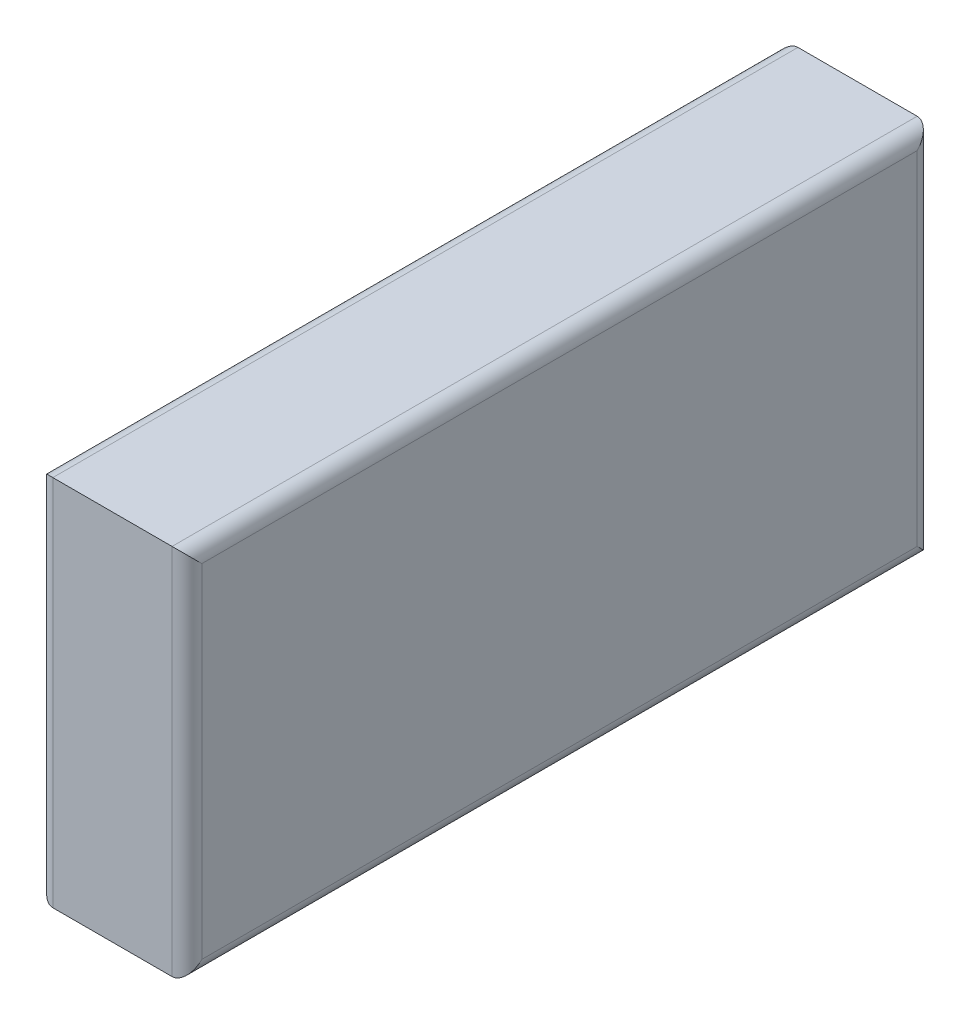
ISO-10303-21;
HEADER;
FILE_DESCRIPTION(('STEP AP214'),'2;1');
FILE_NAME('part.step','',(''),(''),'','','');
FILE_SCHEMA(('AUTOMOTIVE_DESIGN { 1 0 10303 214 1 1 1 1 }'));
ENDSEC;
DATA;
#1=APPLICATION_CONTEXT('core data for automotive mechanical design processes');
#2=APPLICATION_PROTOCOL_DEFINITION('international standard','automotive_design',2000,#1);
#3=PRODUCT_CONTEXT('',#1,'mechanical');
#4=PRODUCT('Part','Part','',(#3));
#5=PRODUCT_RELATED_PRODUCT_CATEGORY('part','',(#4));
#6=PRODUCT_DEFINITION_FORMATION('','',#4);
#7=PRODUCT_DEFINITION_CONTEXT('part definition',#1,'design');
#8=PRODUCT_DEFINITION('design','',#6,#7);
#9=PRODUCT_DEFINITION_SHAPE('','',#8);
#10=(LENGTH_UNIT() NAMED_UNIT(*) SI_UNIT(.MILLI.,.METRE.));
#11=(NAMED_UNIT(*) PLANE_ANGLE_UNIT() SI_UNIT($,.RADIAN.));
#12=(NAMED_UNIT(*) SI_UNIT($,.STERADIAN.) SOLID_ANGLE_UNIT());
#13=UNCERTAINTY_MEASURE_WITH_UNIT(LENGTH_MEASURE(1.E-05),#10,'distance_accuracy_value','');
#14=(GEOMETRIC_REPRESENTATION_CONTEXT(3) GLOBAL_UNCERTAINTY_ASSIGNED_CONTEXT((#13)) GLOBAL_UNIT_ASSIGNED_CONTEXT((#10,
#11,#12)) REPRESENTATION_CONTEXT('',''));
#15=CARTESIAN_POINT('',(0.,0.,0.));
#16=DIRECTION('',(0.,0.,1.));
#17=DIRECTION('',(1.,0.,0.));
#18=AXIS2_PLACEMENT_3D('',#15,#16,#17);
#19=CARTESIAN_POINT('',(-30.111803819155,8.0928080606027,100.));
#20=DIRECTION('',(1.,0.,0.));
#21=DIRECTION('',(0.,1.,0.));
#22=AXIS2_PLACEMENT_3D('',#19,#20,#21);
#23=PLANE('',#22);
#24=DIRECTION('',(0.,-1.,0.));
#25=VECTOR('',#24,1.);
#26=CARTESIAN_POINT('',(-30.111803819155,8.0928080606027,2.));
#27=LINE('',#26,#25);
#28=CARTESIAN_POINT('',(-30.111803819155,6.0928080606027,2.));
#29=VERTEX_POINT('',#28);
#30=CARTESIAN_POINT('',(-30.111803819155,-39.9071919393973,2.));
#31=VERTEX_POINT('',#30);
#32=EDGE_CURVE('E122',#29,#31,#27,.T.);
#33=ORIENTED_EDGE('',*,*,#32,.T.);
#34=DIRECTION('',(0.,0.,-1.));
#35=VECTOR('',#34,1.);
#36=CARTESIAN_POINT('',(-30.111803819155,-39.9071919393973,100.));
#37=LINE('',#36,#35);
#38=CARTESIAN_POINT('',(-30.111803819155,-39.9071919393973,98.));
#39=VERTEX_POINT('',#38);
#40=EDGE_CURVE('E117',#31,#39,#37,.F.);
#41=ORIENTED_EDGE('',*,*,#40,.T.);
#42=DIRECTION('',(0.,-1.,0.));
#43=VECTOR('',#42,1.);
#44=CARTESIAN_POINT('',(-30.111803819155,8.0928080606027,98.));
#45=LINE('',#44,#43);
#46=CARTESIAN_POINT('',(-30.111803819155,6.0928080606027,98.));
#47=VERTEX_POINT('',#46);
#48=EDGE_CURVE('E110',#39,#47,#45,.F.);
#49=ORIENTED_EDGE('',*,*,#48,.T.);
#50=DIRECTION('',(0.,0.,-1.));
#51=VECTOR('',#50,1.);
#52=CARTESIAN_POINT('',(-30.111803819155,6.0928080606027,100.));
#53=LINE('',#52,#51);
#54=EDGE_CURVE('E114',#47,#29,#53,.T.);
#55=ORIENTED_EDGE('',*,*,#54,.T.);
#56=EDGE_LOOP('',(#33,#41,#49,#55));
#57=FACE_BOUND('',#56,.T.);
#58=ADVANCED_FACE('F43',(#57),#23,.F.);
#59=CARTESIAN_POINT('',(-30.111803819155,-41.9071919393973,100.));
#60=DIRECTION('',(0.,1.,0.));
#61=DIRECTION('',(0.,0.,1.));
#62=AXIS2_PLACEMENT_3D('',#59,#60,#61);
#63=PLANE('',#62);
#64=DIRECTION('',(1.,0.,0.));
#65=VECTOR('',#64,1.);
#66=CARTESIAN_POINT('',(-30.111803819155,-41.9071919393973,100.));
#67=LINE('',#66,#65);
#68=CARTESIAN_POINT('',(-28.111803819155,-41.9071919393973,100.));
#69=VERTEX_POINT('',#68);
#70=CARTESIAN_POINT('',(-12.111803819155,-41.9071919393973,100.));
#71=VERTEX_POINT('',#70);
#72=EDGE_CURVE('E141',#69,#71,#67,.T.);
#73=ORIENTED_EDGE('',*,*,#72,.F.);
#74=DIRECTION('',(0.,0.,-1.));
#75=VECTOR('',#74,1.);
#76=CARTESIAN_POINT('',(-28.111803819155,-41.9071919393973,100.));
#77=LINE('',#76,#75);
#78=CARTESIAN_POINT('',(-28.111803819155,-41.9071919393973,0.));
#79=VERTEX_POINT('',#78);
#80=EDGE_CURVE('E179',#69,#79,#77,.T.);
#81=ORIENTED_EDGE('',*,*,#80,.T.);
#82=DIRECTION('',(1.,0.,0.));
#83=VECTOR('',#82,1.);
#84=CARTESIAN_POINT('',(-30.111803819155,-41.9071919393973,0.));
#85=LINE('',#84,#83);
#86=CARTESIAN_POINT('',(-12.111803819155,-41.9071919393973,0.));
#87=VERTEX_POINT('',#86);
#88=EDGE_CURVE('E131',#79,#87,#85,.T.);
#89=ORIENTED_EDGE('',*,*,#88,.T.);
#90=DIRECTION('',(0.,0.,-1.));
#91=VECTOR('',#90,1.);
#92=CARTESIAN_POINT('',(-12.111803819155,-41.9071919393973,100.));
#93=LINE('',#92,#91);
#94=EDGE_CURVE('E176',#87,#71,#93,.F.);
#95=ORIENTED_EDGE('',*,*,#94,.T.);
#96=EDGE_LOOP('',(#73,#81,#89,#95));
#97=FACE_BOUND('',#96,.T.);
#98=ADVANCED_FACE('F230',(#97),#63,.F.);
#99=CARTESIAN_POINT('',(-10.111803819155,8.0928080606027,100.));
#100=DIRECTION('',(-1.,0.,0.));
#101=DIRECTION('',(0.,-1.,0.));
#102=AXIS2_PLACEMENT_3D('',#99,#100,#101);
#103=PLANE('',#102);
#104=DIRECTION('',(0.,1.,0.));
#105=VECTOR('',#104,1.);
#106=CARTESIAN_POINT('',(-10.111803819155,-41.9071919393973,98.));
#107=LINE('',#106,#105);
#108=CARTESIAN_POINT('',(-10.111803819155,6.0928080606027,98.));
#109=VERTEX_POINT('',#108);
#110=CARTESIAN_POINT('',(-10.111803819155,-39.9071919393973,98.));
#111=VERTEX_POINT('',#110);
#112=EDGE_CURVE('E162',#109,#111,#107,.F.);
#113=ORIENTED_EDGE('',*,*,#112,.T.);
#114=DIRECTION('',(0.,0.,-1.));
#115=VECTOR('',#114,1.);
#116=CARTESIAN_POINT('',(-10.111803819155,-39.9071919393973,100.));
#117=LINE('',#116,#115);
#118=CARTESIAN_POINT('',(-10.111803819155,-39.9071919393973,2.));
#119=VERTEX_POINT('',#118);
#120=EDGE_CURVE('E169',#111,#119,#117,.T.);
#121=ORIENTED_EDGE('',*,*,#120,.T.);
#122=DIRECTION('',(0.,1.,0.));
#123=VECTOR('',#122,1.);
#124=CARTESIAN_POINT('',(-10.111803819155,8.0928080606027,2.));
#125=LINE('',#124,#123);
#126=CARTESIAN_POINT('',(-10.111803819155,6.0928080606027,2.));
#127=VERTEX_POINT('',#126);
#128=EDGE_CURVE('E165',#119,#127,#125,.T.);
#129=ORIENTED_EDGE('',*,*,#128,.T.);
#130=DIRECTION('',(0.,0.,-1.));
#131=VECTOR('',#130,1.);
#132=CARTESIAN_POINT('',(-10.111803819155,6.0928080606027,100.));
#133=LINE('',#132,#131);
#134=EDGE_CURVE('E159',#127,#109,#133,.F.);
#135=ORIENTED_EDGE('',*,*,#134,.T.);
#136=EDGE_LOOP('',(#113,#121,#129,#135));
#137=FACE_BOUND('',#136,.T.);
#138=ADVANCED_FACE('F228',(#137),#103,.F.);
#139=CARTESIAN_POINT('',(-30.111803819155,8.0928080606027,100.));
#140=DIRECTION('',(0.,-1.,0.));
#141=DIRECTION('',(0.,0.,-1.));
#142=AXIS2_PLACEMENT_3D('',#139,#140,#141);
#143=PLANE('',#142);
#144=DIRECTION('',(-1.,0.,0.));
#145=VECTOR('',#144,1.);
#146=CARTESIAN_POINT('',(-30.111803819155,8.0928080606027,0.));
#147=LINE('',#146,#145);
#148=CARTESIAN_POINT('',(-12.111803819155,8.0928080606027,0.));
#149=VERTEX_POINT('',#148);
#150=CARTESIAN_POINT('',(-28.111803819155,8.0928080606027,0.));
#151=VERTEX_POINT('',#150);
#152=EDGE_CURVE('E144',#149,#151,#147,.T.);
#153=ORIENTED_EDGE('',*,*,#152,.T.);
#154=DIRECTION('',(0.,0.,-1.));
#155=VECTOR('',#154,1.);
#156=CARTESIAN_POINT('',(-28.111803819155,8.0928080606027,100.));
#157=LINE('',#156,#155);
#158=CARTESIAN_POINT('',(-28.111803819155,8.0928080606027,100.));
#159=VERTEX_POINT('',#158);
#160=EDGE_CURVE('E11',#151,#159,#157,.F.);
#161=ORIENTED_EDGE('',*,*,#160,.T.);
#162=DIRECTION('',(-1.,0.,0.));
#163=VECTOR('',#162,1.);
#164=CARTESIAN_POINT('',(-30.111803819155,8.0928080606027,100.));
#165=LINE('',#164,#163);
#166=CARTESIAN_POINT('',(-12.111803819155,8.0928080606027,100.));
#167=VERTEX_POINT('',#166);
#168=EDGE_CURVE('E138',#167,#159,#165,.T.);
#169=ORIENTED_EDGE('',*,*,#168,.F.);
#170=DIRECTION('',(0.,0.,-1.));
#171=VECTOR('',#170,1.);
#172=CARTESIAN_POINT('',(-12.111803819155,8.0928080606027,100.));
#173=LINE('',#172,#171);
#174=EDGE_CURVE('E53',#167,#149,#173,.T.);
#175=ORIENTED_EDGE('',*,*,#174,.T.);
#176=EDGE_LOOP('',(#153,#161,#169,#175));
#177=FACE_BOUND('',#176,.T.);
#178=ADVANCED_FACE('F216',(#177),#143,.F.);
#179=CARTESIAN_POINT('',(0.,0.,100.));
#180=DIRECTION('',(0.,0.,1.));
#181=DIRECTION('',(1.,0.,0.));
#182=AXIS2_PLACEMENT_3D('',#179,#180,#181);
#183=PLANE('',#182);
#184=ORIENTED_EDGE('',*,*,#168,.T.);
#185=DIRECTION('',(0.,-1.,0.));
#186=VECTOR('',#185,1.);
#187=CARTESIAN_POINT('',(-28.111803819155,-41.9071919393973,100.));
#188=LINE('',#187,#186);
#189=EDGE_CURVE('E128',#159,#69,#188,.T.);
#190=ORIENTED_EDGE('',*,*,#189,.T.);
#191=ORIENTED_EDGE('',*,*,#72,.T.);
#192=DIRECTION('',(0.,1.,0.));
#193=VECTOR('',#192,1.);
#194=CARTESIAN_POINT('',(-12.111803819155,8.0928080606027,100.));
#195=LINE('',#194,#193);
#196=EDGE_CURVE('E66',#71,#167,#195,.T.);
#197=ORIENTED_EDGE('',*,*,#196,.T.);
#198=EDGE_LOOP('',(#184,#190,#191,#197));
#199=FACE_BOUND('',#198,.T.);
#200=ADVANCED_FACE('F236',(#199),#183,.T.);
#201=CARTESIAN_POINT('',(0.,0.,0.));
#202=DIRECTION('',(0.,0.,1.));
#203=DIRECTION('',(1.,0.,0.));
#204=AXIS2_PLACEMENT_3D('',#201,#202,#203);
#205=PLANE('',#204);
#206=ORIENTED_EDGE('',*,*,#88,.F.);
#207=DIRECTION('',(0.,-1.,0.));
#208=VECTOR('',#207,1.);
#209=CARTESIAN_POINT('',(-28.111803819155,0.,0.));
#210=LINE('',#209,#208);
#211=EDGE_CURVE('E155',#79,#151,#210,.F.);
#212=ORIENTED_EDGE('',*,*,#211,.T.);
#213=ORIENTED_EDGE('',*,*,#152,.F.);
#214=DIRECTION('',(0.,1.,0.));
#215=VECTOR('',#214,1.);
#216=CARTESIAN_POINT('',(-12.111803819155,0.,0.));
#217=LINE('',#216,#215);
#218=EDGE_CURVE('E151',#149,#87,#217,.F.);
#219=ORIENTED_EDGE('',*,*,#218,.T.);
#220=EDGE_LOOP('',(#206,#212,#213,#219));
#221=FACE_BOUND('',#220,.T.);
#222=ADVANCED_FACE('F220',(#221),#205,.F.);
#223=CARTESIAN_POINT('',(-28.111803819155,0.,98.));
#224=DIRECTION('',(0.,1.,0.));
#225=DIRECTION('',(-1.,0.,0.));
#226=AXIS2_PLACEMENT_3D('',#223,#224,#225);
#227=CYLINDRICAL_SURFACE('',#226,2.);
#228=CARTESIAN_POINT('',(-28.111803819155,-39.9071919393973,98.));
#229=DIRECTION('',(0.,-0.707106781186547,-0.707106781186547));
#230=DIRECTION('',(0.,0.707106781186547,-0.707106781186547));
#231=AXIS2_PLACEMENT_3D('',#228,#229,#230);
#232=ELLIPSE('',#231,2.82842712474619,2.);
#233=EDGE_CURVE('E132',#69,#39,#232,.T.);
#234=ORIENTED_EDGE('',*,*,#233,.F.);
#235=ORIENTED_EDGE('',*,*,#189,.F.);
#236=CARTESIAN_POINT('',(-28.111803819155,6.0928080606027,98.));
#237=DIRECTION('',(0.,0.707106781186547,-0.707106781186547));
#238=DIRECTION('',(0.,-0.707106781186547,-0.707106781186547));
#239=AXIS2_PLACEMENT_3D('',#236,#237,#238);
#240=ELLIPSE('',#239,2.82842712474619,2.);
#241=EDGE_CURVE('E126',#47,#159,#240,.T.);
#242=ORIENTED_EDGE('',*,*,#241,.F.);
#243=ORIENTED_EDGE('',*,*,#48,.F.);
#244=EDGE_LOOP('',(#234,#235,#242,#243));
#245=FACE_BOUND('',#244,.T.);
#246=ADVANCED_FACE('F127',(#245),#227,.T.);
#247=CARTESIAN_POINT('',(-28.111803819155,6.0928080606027,100.));
#248=DIRECTION('',(0.,0.,-1.));
#249=DIRECTION('',(-1.,0.,0.));
#250=AXIS2_PLACEMENT_3D('',#247,#248,#249);
#251=CYLINDRICAL_SURFACE('',#250,2.);
#252=ORIENTED_EDGE('',*,*,#241,.T.);
#253=ORIENTED_EDGE('',*,*,#160,.F.);
#254=CARTESIAN_POINT('',(-28.111803819155,6.0928080606027,2.));
#255=DIRECTION('',(0.,-0.707106781186547,-0.707106781186547));
#256=DIRECTION('',(0.,0.707106781186547,-0.707106781186547));
#257=AXIS2_PLACEMENT_3D('',#254,#255,#256);
#258=ELLIPSE('',#257,2.82842712474619,2.);
#259=EDGE_CURVE('E135',#29,#151,#258,.T.);
#260=ORIENTED_EDGE('',*,*,#259,.F.);
#261=ORIENTED_EDGE('',*,*,#54,.F.);
#262=EDGE_LOOP('',(#252,#253,#260,#261));
#263=FACE_BOUND('',#262,.T.);
#264=ADVANCED_FACE('F134',(#263),#251,.T.);
#265=CARTESIAN_POINT('',(-28.111803819155,-39.9071919393973,100.));
#266=DIRECTION('',(0.,0.,-1.));
#267=DIRECTION('',(-1.,0.,0.));
#268=AXIS2_PLACEMENT_3D('',#265,#266,#267);
#269=CYLINDRICAL_SURFACE('',#268,2.);
#270=ORIENTED_EDGE('',*,*,#233,.T.);
#271=ORIENTED_EDGE('',*,*,#40,.F.);
#272=CARTESIAN_POINT('',(-28.111803819155,-39.9071919393973,2.));
#273=DIRECTION('',(0.,0.707106781186547,-0.707106781186547));
#274=DIRECTION('',(0.,-0.707106781186547,-0.707106781186547));
#275=AXIS2_PLACEMENT_3D('',#272,#273,#274);
#276=ELLIPSE('',#275,2.82842712474619,2.);
#277=EDGE_CURVE('E184',#79,#31,#276,.T.);
#278=ORIENTED_EDGE('',*,*,#277,.F.);
#279=ORIENTED_EDGE('',*,*,#80,.F.);
#280=EDGE_LOOP('',(#270,#271,#278,#279));
#281=FACE_BOUND('',#280,.T.);
#282=ADVANCED_FACE('F248',(#281),#269,.T.);
#283=CARTESIAN_POINT('',(-28.111803819155,8.0928080606027,2.));
#284=DIRECTION('',(0.,-1.,0.));
#285=DIRECTION('',(1.,0.,0.));
#286=AXIS2_PLACEMENT_3D('',#283,#284,#285);
#287=CYLINDRICAL_SURFACE('',#286,2.);
#288=ORIENTED_EDGE('',*,*,#259,.T.);
#289=ORIENTED_EDGE('',*,*,#211,.F.);
#290=ORIENTED_EDGE('',*,*,#277,.T.);
#291=ORIENTED_EDGE('',*,*,#32,.F.);
#292=EDGE_LOOP('',(#288,#289,#290,#291));
#293=FACE_BOUND('',#292,.T.);
#294=ADVANCED_FACE('F245',(#293),#287,.T.);
#295=CARTESIAN_POINT('',(-12.111803819155,0.,98.));
#296=DIRECTION('',(0.,-1.,0.));
#297=DIRECTION('',(1.,0.,0.));
#298=AXIS2_PLACEMENT_3D('',#295,#296,#297);
#299=CYLINDRICAL_SURFACE('',#298,2.);
#300=CARTESIAN_POINT('',(-12.111803819155,6.0928080606027,98.));
#301=DIRECTION('',(0.,0.707106781186547,-0.707106781186547));
#302=DIRECTION('',(0.,-0.707106781186547,-0.707106781186547));
#303=AXIS2_PLACEMENT_3D('',#300,#301,#302);
#304=ELLIPSE('',#303,2.82842712474619,2.);
#305=EDGE_CURVE('E196',#167,#109,#304,.T.);
#306=ORIENTED_EDGE('',*,*,#305,.F.);
#307=ORIENTED_EDGE('',*,*,#196,.F.);
#308=CARTESIAN_POINT('',(-12.111803819155,-39.9071919393973,98.));
#309=DIRECTION('',(0.,-0.707106781186547,-0.707106781186547));
#310=DIRECTION('',(0.,0.707106781186547,-0.707106781186547));
#311=AXIS2_PLACEMENT_3D('',#308,#309,#310);
#312=ELLIPSE('',#311,2.82842712474619,2.);
#313=EDGE_CURVE('E47',#111,#71,#312,.T.);
#314=ORIENTED_EDGE('',*,*,#313,.F.);
#315=ORIENTED_EDGE('',*,*,#112,.F.);
#316=EDGE_LOOP('',(#306,#307,#314,#315));
#317=FACE_BOUND('',#316,.T.);
#318=ADVANCED_FACE('F45',(#317),#299,.T.);
#319=CARTESIAN_POINT('',(-12.111803819155,-39.9071919393973,100.));
#320=DIRECTION('',(0.,0.,-1.));
#321=DIRECTION('',(-1.,0.,0.));
#322=AXIS2_PLACEMENT_3D('',#319,#320,#321);
#323=CYLINDRICAL_SURFACE('',#322,2.);
#324=ORIENTED_EDGE('',*,*,#313,.T.);
#325=ORIENTED_EDGE('',*,*,#94,.F.);
#326=CARTESIAN_POINT('',(-12.111803819155,-39.9071919393973,2.));
#327=DIRECTION('',(0.,0.707106781186547,-0.707106781186547));
#328=DIRECTION('',(0.,-0.707106781186547,-0.707106781186547));
#329=AXIS2_PLACEMENT_3D('',#326,#327,#328);
#330=ELLIPSE('',#329,2.82842712474619,2.);
#331=EDGE_CURVE('E194',#119,#87,#330,.T.);
#332=ORIENTED_EDGE('',*,*,#331,.F.);
#333=ORIENTED_EDGE('',*,*,#120,.F.);
#334=EDGE_LOOP('',(#324,#325,#332,#333));
#335=FACE_BOUND('',#334,.T.);
#336=ADVANCED_FACE('F209',(#335),#323,.T.);
#337=CARTESIAN_POINT('',(-12.111803819155,6.0928080606027,100.));
#338=DIRECTION('',(0.,0.,-1.));
#339=DIRECTION('',(-1.,0.,0.));
#340=AXIS2_PLACEMENT_3D('',#337,#338,#339);
#341=CYLINDRICAL_SURFACE('',#340,2.);
#342=ORIENTED_EDGE('',*,*,#305,.T.);
#343=ORIENTED_EDGE('',*,*,#134,.F.);
#344=CARTESIAN_POINT('',(-12.111803819155,6.0928080606027,2.));
#345=DIRECTION('',(0.,-0.707106781186547,-0.707106781186547));
#346=DIRECTION('',(0.,0.707106781186547,-0.707106781186547));
#347=AXIS2_PLACEMENT_3D('',#344,#345,#346);
#348=ELLIPSE('',#347,2.82842712474619,2.);
#349=EDGE_CURVE('E191',#149,#127,#348,.T.);
#350=ORIENTED_EDGE('',*,*,#349,.F.);
#351=ORIENTED_EDGE('',*,*,#174,.F.);
#352=EDGE_LOOP('',(#342,#343,#350,#351));
#353=FACE_BOUND('',#352,.T.);
#354=ADVANCED_FACE('F214',(#353),#341,.T.);
#355=CARTESIAN_POINT('',(-12.111803819155,8.0928080606027,2.));
#356=DIRECTION('',(0.,1.,0.));
#357=DIRECTION('',(-1.,0.,0.));
#358=AXIS2_PLACEMENT_3D('',#355,#356,#357);
#359=CYLINDRICAL_SURFACE('',#358,2.);
#360=ORIENTED_EDGE('',*,*,#331,.T.);
#361=ORIENTED_EDGE('',*,*,#218,.F.);
#362=ORIENTED_EDGE('',*,*,#349,.T.);
#363=ORIENTED_EDGE('',*,*,#128,.F.);
#364=EDGE_LOOP('',(#360,#361,#362,#363));
#365=FACE_BOUND('',#364,.T.);
#366=ADVANCED_FACE('F225',(#365),#359,.T.);
#367=CLOSED_SHELL('',(#58,#98,#138,#178,#200,#222,#246,#264,#282,#294,#318,#336,#354,#366));
#368=MANIFOLD_SOLID_BREP('B2',#367);
#369=ADVANCED_BREP_SHAPE_REPRESENTATION('',(#18,#368),#14);
#370=SHAPE_DEFINITION_REPRESENTATION(#9,#369);
ENDSEC;
END-ISO-10303-21;
